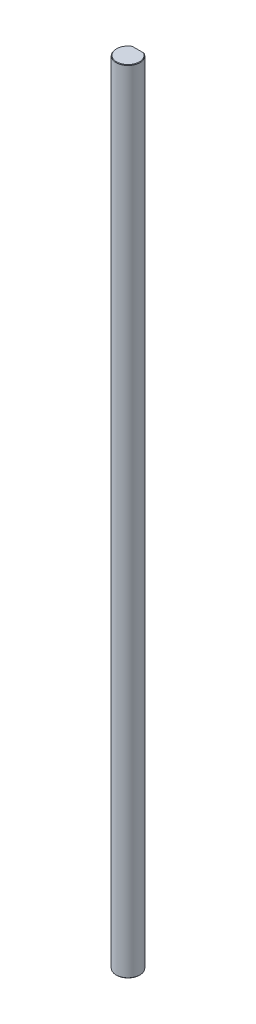
ISO-10303-21;
HEADER;
FILE_DESCRIPTION(('STEP AP214'),'2;1');
FILE_NAME('part.step','',(''),(''),'','','');
FILE_SCHEMA(('AUTOMOTIVE_DESIGN { 1 0 10303 214 1 1 1 1 }'));
ENDSEC;
DATA;
#1=APPLICATION_CONTEXT('core data for automotive mechanical design processes');
#2=APPLICATION_PROTOCOL_DEFINITION('international standard','automotive_design',2000,#1);
#3=PRODUCT_CONTEXT('',#1,'mechanical');
#4=PRODUCT('Part','Part','',(#3));
#5=PRODUCT_RELATED_PRODUCT_CATEGORY('part','',(#4));
#6=PRODUCT_DEFINITION_FORMATION('','',#4);
#7=PRODUCT_DEFINITION_CONTEXT('part definition',#1,'design');
#8=PRODUCT_DEFINITION('design','',#6,#7);
#9=PRODUCT_DEFINITION_SHAPE('','',#8);
#10=(LENGTH_UNIT() NAMED_UNIT(*) SI_UNIT(.MILLI.,.METRE.));
#11=(NAMED_UNIT(*) PLANE_ANGLE_UNIT() SI_UNIT($,.RADIAN.));
#12=(NAMED_UNIT(*) SI_UNIT($,.STERADIAN.) SOLID_ANGLE_UNIT());
#13=UNCERTAINTY_MEASURE_WITH_UNIT(LENGTH_MEASURE(1.E-05),#10,'distance_accuracy_value','');
#14=(GEOMETRIC_REPRESENTATION_CONTEXT(3) GLOBAL_UNCERTAINTY_ASSIGNED_CONTEXT((#13)) GLOBAL_UNIT_ASSIGNED_CONTEXT((#10,
#11,#12)) REPRESENTATION_CONTEXT('',''));
#15=CARTESIAN_POINT('',(0.,0.,0.));
#16=DIRECTION('',(0.,0.,1.));
#17=DIRECTION('',(1.,0.,0.));
#18=AXIS2_PLACEMENT_3D('',#15,#16,#17);
#19=CARTESIAN_POINT('',(0.,200.,0.));
#20=DIRECTION('',(0.,-1.,0.));
#21=DIRECTION('',(0.,0.,-1.));
#22=AXIS2_PLACEMENT_3D('',#19,#20,#21);
#23=CONICAL_SURFACE('',#22,2.87500000000004,0.78539816339744);
#24=CARTESIAN_POINT('',(-1.6583123951777,199.875,-2.5));
#25=CARTESIAN_POINT('',(-1.57973572193478,199.918434890403,-2.5));
#26=CARTESIAN_POINT('',(-1.50022900034245,199.960246696465,-2.5));
#27=CARTESIAN_POINT('',(-1.41972708645016,200.,-2.5));
#28=(BOUNDED_CURVE() B_SPLINE_CURVE(3,(#24,#25,#26,#27),.UNSPECIFIED.,.F.,
.F.) B_SPLINE_CURVE_WITH_KNOTS((4,4),(0.,0.000269347265701004),
.UNSPECIFIED.) CURVE() GEOMETRIC_REPRESENTATION_ITEM() RATIONAL_B_SPLINE_CURVE((1.,1.,1.,1.)) REPRESENTATION_ITEM(''));
#29=CARTESIAN_POINT('',(-1.6583123951777,199.875,-2.5));
#30=VERTEX_POINT('',#29);
#31=CARTESIAN_POINT('',(-1.41972708645016,200.,-2.5));
#32=VERTEX_POINT('',#31);
#33=EDGE_CURVE('E113',#30,#32,#28,.T.);
#34=ORIENTED_EDGE('',*,*,#33,.F.);
#35=CARTESIAN_POINT('',(0.,199.875,0.));
#36=DIRECTION('',(0.,-1.,0.));
#37=DIRECTION('',(0.,0.,1.));
#38=AXIS2_PLACEMENT_3D('',#35,#36,#37);
#39=CIRCLE('',#38,3.);
#40=CARTESIAN_POINT('',(1.6583123951777,199.875,-2.5));
#41=VERTEX_POINT('',#40);
#42=EDGE_CURVE('E85',#41,#30,#39,.T.);
#43=ORIENTED_EDGE('',*,*,#42,.F.);
#44=CARTESIAN_POINT('',(1.41972708645016,200.,-2.5));
#45=CARTESIAN_POINT('',(1.50022900034244,199.960246696465,-2.5));
#46=CARTESIAN_POINT('',(1.57973572193478,199.918434890403,-2.5));
#47=CARTESIAN_POINT('',(1.6583123951777,199.875,-2.5));
#48=(BOUNDED_CURVE() B_SPLINE_CURVE(3,(#44,#45,#46,#47),.UNSPECIFIED.,.F.,
.F.) B_SPLINE_CURVE_WITH_KNOTS((4,4),(0.,0.000269347265700999),
.UNSPECIFIED.) CURVE() GEOMETRIC_REPRESENTATION_ITEM() RATIONAL_B_SPLINE_CURVE((1.,1.,1.,1.)) REPRESENTATION_ITEM(''));
#49=CARTESIAN_POINT('',(1.41972708645016,200.,-2.5));
#50=VERTEX_POINT('',#49);
#51=EDGE_CURVE('E133',#50,#41,#48,.T.);
#52=ORIENTED_EDGE('',*,*,#51,.F.);
#53=CARTESIAN_POINT('',(0.,200.,0.));
#54=DIRECTION('',(0.,1.,0.));
#55=DIRECTION('',(0.,0.,1.));
#56=AXIS2_PLACEMENT_3D('',#53,#54,#55);
#57=CIRCLE('',#56,2.87500000000004);
#58=EDGE_CURVE('E27',#32,#50,#57,.T.);
#59=ORIENTED_EDGE('',*,*,#58,.F.);
#60=EDGE_LOOP('',(#34,#43,#52,#59));
#61=FACE_BOUND('',#60,.T.);
#62=ADVANCED_FACE('F16',(#61),#23,.T.);
#63=CARTESIAN_POINT('',(0.,0.125000000000069,0.));
#64=DIRECTION('',(0.,1.,0.));
#65=DIRECTION('',(0.,0.,1.));
#66=AXIS2_PLACEMENT_3D('',#63,#64,#65);
#67=CONICAL_SURFACE('',#66,3.,0.785398163397327);
#68=DIRECTION('',(0.,0.707106781186633,0.707106781186462));
#69=VECTOR('',#68,1.);
#70=CARTESIAN_POINT('',(0.,0.125000000000069,3.));
#71=LINE('',#70,#69);
#72=CARTESIAN_POINT('',(0.,0.,2.87499999999996));
#73=VERTEX_POINT('',#72);
#74=CARTESIAN_POINT('',(0.,0.125000000000069,3.));
#75=VERTEX_POINT('',#74);
#76=EDGE_CURVE('E103',#73,#75,#71,.T.);
#77=ORIENTED_EDGE('',*,*,#76,.F.);
#78=CARTESIAN_POINT('',(0.,0.,0.));
#79=DIRECTION('',(0.,-1.,0.));
#80=DIRECTION('',(0.,0.,1.));
#81=AXIS2_PLACEMENT_3D('',#78,#79,#80);
#82=CIRCLE('',#81,2.87499999999996);
#83=CARTESIAN_POINT('',(1.41972708644999,0.,-2.5));
#84=VERTEX_POINT('',#83);
#85=EDGE_CURVE('E10',#84,#73,#82,.T.);
#86=ORIENTED_EDGE('',*,*,#85,.F.);
#87=CARTESIAN_POINT('',(1.6583123951777,0.125000000000069,-2.5));
#88=CARTESIAN_POINT('',(1.57973572193473,0.0815651095965109,-2.5));
#89=CARTESIAN_POINT('',(1.50022900034235,0.0397533035352983,-2.5));
#90=CARTESIAN_POINT('',(1.41972708644999,0.,-2.5));
#91=(BOUNDED_CURVE() B_SPLINE_CURVE(3,(#87,#88,#89,#90),.UNSPECIFIED.,.F.,
.F.) B_SPLINE_CURVE_WITH_KNOTS((4,4),(0.,0.000269347265701203),
.UNSPECIFIED.) CURVE() GEOMETRIC_REPRESENTATION_ITEM() RATIONAL_B_SPLINE_CURVE((1.,1.,1.,1.)) REPRESENTATION_ITEM(''));
#92=CARTESIAN_POINT('',(1.6583123951777,0.125000000000069,-2.5));
#93=VERTEX_POINT('',#92);
#94=EDGE_CURVE('E130',#93,#84,#91,.T.);
#95=ORIENTED_EDGE('',*,*,#94,.F.);
#96=CARTESIAN_POINT('',(0.,0.125000000000069,0.));
#97=DIRECTION('',(0.,1.,0.));
#98=DIRECTION('',(0.,0.,1.));
#99=AXIS2_PLACEMENT_3D('',#96,#97,#98);
#100=CIRCLE('',#99,3.);
#101=EDGE_CURVE('E20',#75,#93,#100,.T.);
#102=ORIENTED_EDGE('',*,*,#101,.F.);
#103=EDGE_LOOP('',(#77,#86,#95,#102));
#104=FACE_BOUND('',#103,.T.);
#105=ADVANCED_FACE('F160',(#104),#67,.T.);
#106=CARTESIAN_POINT('',(0.,0.,0.));
#107=DIRECTION('',(0.,1.,0.));
#108=DIRECTION('',(1.,0.,0.));
#109=AXIS2_PLACEMENT_3D('',#106,#107,#108);
#110=PLANE('',#109);
#111=DIRECTION('',(1.,0.,0.));
#112=VECTOR('',#111,1.);
#113=CARTESIAN_POINT('',(0.,0.,-2.5));
#114=LINE('',#113,#112);
#115=CARTESIAN_POINT('',(-1.41972708644999,0.,-2.5));
#116=VERTEX_POINT('',#115);
#117=EDGE_CURVE('E96',#116,#84,#114,.T.);
#118=ORIENTED_EDGE('',*,*,#117,.T.);
#119=ORIENTED_EDGE('',*,*,#85,.T.);
#120=CARTESIAN_POINT('',(0.,0.,0.));
#121=DIRECTION('',(0.,-1.,0.));
#122=DIRECTION('',(0.,0.,1.));
#123=AXIS2_PLACEMENT_3D('',#120,#121,#122);
#124=CIRCLE('',#123,2.87499999999996);
#125=EDGE_CURVE('E109',#73,#116,#124,.T.);
#126=ORIENTED_EDGE('',*,*,#125,.T.);
#127=EDGE_LOOP('',(#118,#119,#126));
#128=FACE_BOUND('',#127,.T.);
#129=ADVANCED_FACE('F157',(#128),#110,.F.);
#130=CARTESIAN_POINT('',(0.,200.,0.));
#131=DIRECTION('',(0.,1.,0.));
#132=DIRECTION('',(1.,0.,0.));
#133=AXIS2_PLACEMENT_3D('',#130,#131,#132);
#134=PLANE('',#133);
#135=DIRECTION('',(1.,0.,0.));
#136=VECTOR('',#135,1.);
#137=CARTESIAN_POINT('',(0.,200.,-2.5));
#138=LINE('',#137,#136);
#139=EDGE_CURVE('E121',#32,#50,#138,.T.);
#140=ORIENTED_EDGE('',*,*,#139,.F.);
#141=ORIENTED_EDGE('',*,*,#58,.T.);
#142=EDGE_LOOP('',(#140,#141));
#143=FACE_BOUND('',#142,.T.);
#144=ADVANCED_FACE('F172',(#143),#134,.T.);
#145=CARTESIAN_POINT('',(0.,200.,-2.5));
#146=DIRECTION('',(0.,0.,-1.));
#147=DIRECTION('',(0.,-1.,0.));
#148=AXIS2_PLACEMENT_3D('',#145,#146,#147);
#149=PLANE('',#148);
#150=DIRECTION('',(0.,-1.,0.));
#151=VECTOR('',#150,1.);
#152=CARTESIAN_POINT('',(1.6583123951777,200.,-2.5));
#153=LINE('',#152,#151);
#154=EDGE_CURVE('E122',#41,#93,#153,.T.);
#155=ORIENTED_EDGE('',*,*,#154,.T.);
#156=ORIENTED_EDGE('',*,*,#94,.T.);
#157=ORIENTED_EDGE('',*,*,#117,.F.);
#158=CARTESIAN_POINT('',(-1.41972708644999,0.,-2.5));
#159=CARTESIAN_POINT('',(-1.50022900034233,0.0397533035353225,-2.5));
#160=CARTESIAN_POINT('',(-1.57973572193473,0.0815651095964986,-2.5));
#161=CARTESIAN_POINT('',(-1.6583123951777,0.125000000000069,-2.5));
#162=(BOUNDED_CURVE() B_SPLINE_CURVE(3,(#158,#159,#160,#161),.UNSPECIFIED.,.F.,
.F.) B_SPLINE_CURVE_WITH_KNOTS((4,4),(0.,0.000269347265701203),
.UNSPECIFIED.) CURVE() GEOMETRIC_REPRESENTATION_ITEM() RATIONAL_B_SPLINE_CURVE((1.,1.,1.,1.)) REPRESENTATION_ITEM(''));
#163=CARTESIAN_POINT('',(-1.6583123951777,0.125000000000069,-2.5));
#164=VERTEX_POINT('',#163);
#165=EDGE_CURVE('E89',#116,#164,#162,.T.);
#166=ORIENTED_EDGE('',*,*,#165,.T.);
#167=DIRECTION('',(0.,-1.,0.));
#168=VECTOR('',#167,1.);
#169=CARTESIAN_POINT('',(-1.6583123951777,200.,-2.5));
#170=LINE('',#169,#168);
#171=EDGE_CURVE('E76',#30,#164,#170,.T.);
#172=ORIENTED_EDGE('',*,*,#171,.F.);
#173=ORIENTED_EDGE('',*,*,#33,.T.);
#174=ORIENTED_EDGE('',*,*,#139,.T.);
#175=ORIENTED_EDGE('',*,*,#51,.T.);
#176=EDGE_LOOP('',(#155,#156,#157,#166,#172,#173,#174,#175));
#177=FACE_BOUND('',#176,.T.);
#178=ADVANCED_FACE('F93',(#177),#149,.T.);
#179=CARTESIAN_POINT('',(0.,200.,0.));
#180=DIRECTION('',(0.,-1.,0.));
#181=DIRECTION('',(0.,0.,-1.));
#182=AXIS2_PLACEMENT_3D('',#179,#180,#181);
#183=CYLINDRICAL_SURFACE('',#182,3.);
#184=ORIENTED_EDGE('',*,*,#171,.T.);
#185=CARTESIAN_POINT('',(0.,0.125000000000069,0.));
#186=DIRECTION('',(0.,1.,0.));
#187=DIRECTION('',(0.,0.,1.));
#188=AXIS2_PLACEMENT_3D('',#185,#186,#187);
#189=CIRCLE('',#188,3.);
#190=EDGE_CURVE('E81',#164,#75,#189,.T.);
#191=ORIENTED_EDGE('',*,*,#190,.T.);
#192=ORIENTED_EDGE('',*,*,#101,.T.);
#193=ORIENTED_EDGE('',*,*,#154,.F.);
#194=ORIENTED_EDGE('',*,*,#42,.T.);
#195=EDGE_LOOP('',(#184,#191,#192,#193,#194));
#196=FACE_BOUND('',#195,.T.);
#197=ADVANCED_FACE('F78',(#196),#183,.T.);
#198=CARTESIAN_POINT('',(0.,0.125000000000069,0.));
#199=DIRECTION('',(0.,1.,0.));
#200=DIRECTION('',(0.,0.,1.));
#201=AXIS2_PLACEMENT_3D('',#198,#199,#200);
#202=CONICAL_SURFACE('',#201,3.,0.785398163397327);
#203=ORIENTED_EDGE('',*,*,#125,.F.);
#204=ORIENTED_EDGE('',*,*,#76,.T.);
#205=ORIENTED_EDGE('',*,*,#190,.F.);
#206=ORIENTED_EDGE('',*,*,#165,.F.);
#207=EDGE_LOOP('',(#203,#204,#205,#206));
#208=FACE_BOUND('',#207,.T.);
#209=ADVANCED_FACE('F18',(#208),#202,.T.);
#210=CLOSED_SHELL('',(#62,#105,#129,#144,#178,#197,#209));
#211=MANIFOLD_SOLID_BREP('B1',#210);
#212=ADVANCED_BREP_SHAPE_REPRESENTATION('',(#18,#211),#14);
#213=SHAPE_DEFINITION_REPRESENTATION(#9,#212);
ENDSEC;
END-ISO-10303-21;
